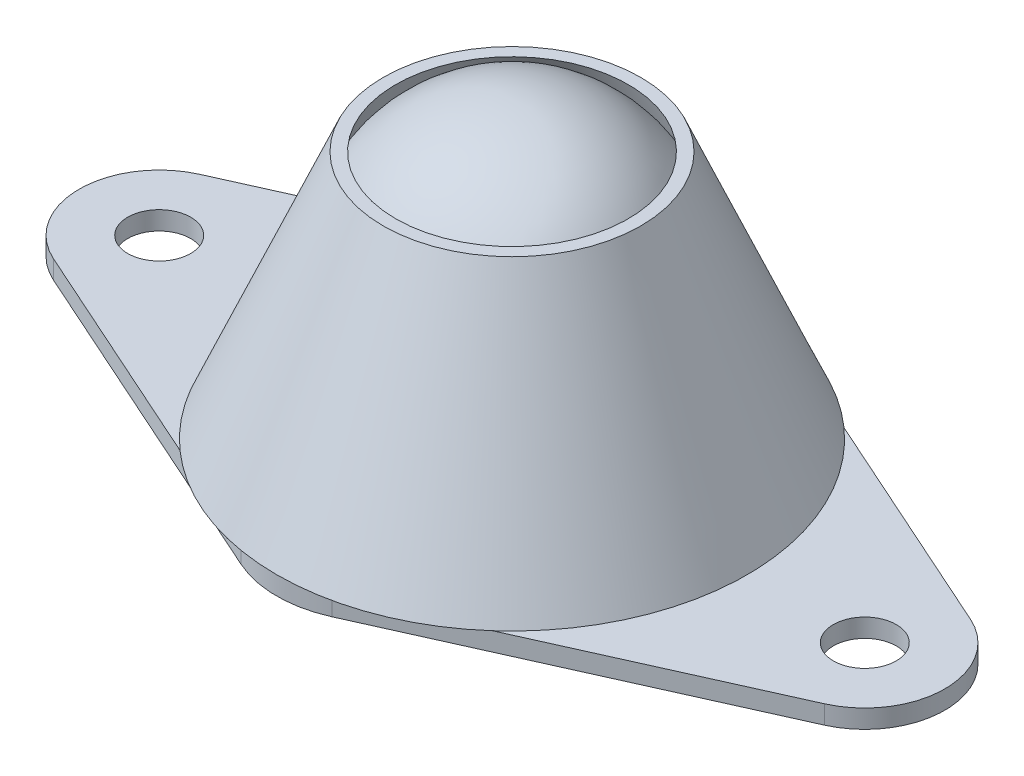
ISO-10303-21;
HEADER;
FILE_DESCRIPTION(('STEP AP214'),'2;1');
FILE_NAME('part.step','',(''),(''),'','','');
FILE_SCHEMA(('AUTOMOTIVE_DESIGN { 1 0 10303 214 1 1 1 1 }'));
ENDSEC;
DATA;
#1=APPLICATION_CONTEXT('core data for automotive mechanical design processes');
#2=APPLICATION_PROTOCOL_DEFINITION('international standard','automotive_design',2000,#1);
#3=PRODUCT_CONTEXT('',#1,'mechanical');
#4=PRODUCT('Part','Part','',(#3));
#5=PRODUCT_RELATED_PRODUCT_CATEGORY('part','',(#4));
#6=PRODUCT_DEFINITION_FORMATION('','',#4);
#7=PRODUCT_DEFINITION_CONTEXT('part definition',#1,'design');
#8=PRODUCT_DEFINITION('design','',#6,#7);
#9=PRODUCT_DEFINITION_SHAPE('','',#8);
#10=(LENGTH_UNIT() NAMED_UNIT(*) SI_UNIT(.MILLI.,.METRE.));
#11=(NAMED_UNIT(*) PLANE_ANGLE_UNIT() SI_UNIT($,.RADIAN.));
#12=(NAMED_UNIT(*) SI_UNIT($,.STERADIAN.) SOLID_ANGLE_UNIT());
#13=UNCERTAINTY_MEASURE_WITH_UNIT(LENGTH_MEASURE(1.E-05),#10,'distance_accuracy_value','');
#14=(GEOMETRIC_REPRESENTATION_CONTEXT(3) GLOBAL_UNCERTAINTY_ASSIGNED_CONTEXT((#13)) GLOBAL_UNIT_ASSIGNED_CONTEXT((#10,
#11,#12)) REPRESENTATION_CONTEXT('',''));
#15=CARTESIAN_POINT('',(0.,0.,0.));
#16=DIRECTION('',(0.,0.,1.));
#17=DIRECTION('',(1.,0.,0.));
#18=AXIS2_PLACEMENT_3D('',#15,#16,#17);
#19=CARTESIAN_POINT('',(0.,8.9375,0.));
#20=DIRECTION('',(0.,1.,0.));
#21=DIRECTION('',(1.,0.,0.));
#22=AXIS2_PLACEMENT_3D('',#19,#20,#21);
#23=SPHERICAL_SURFACE('',#22,7.9375);
#24=CARTESIAN_POINT('',(0.,16.875,0.));
#25=VERTEX_POINT('',#24);
#26=VERTEX_LOOP('',#25);
#27=FACE_BOUND('',#26,.T.);
#28=ADVANCED_FACE('F42',(#27),#23,.T.);
#29=CLOSED_SHELL('',(#28));
#30=MANIFOLD_SOLID_BREP('B2',#29);
#31=CARTESIAN_POINT('',(-19.05,1.,0.));
#32=DIRECTION('',(0.,-1.,0.));
#33=DIRECTION('',(0.,0.,-1.));
#34=AXIS2_PLACEMENT_3D('',#31,#32,#33);
#35=PLANE('',#34);
#36=CARTESIAN_POINT('',(19.05,1.,0.));
#37=DIRECTION('',(0.,-1.,0.));
#38=DIRECTION('',(0.,0.,-1.));
#39=AXIS2_PLACEMENT_3D('',#36,#37,#38);
#40=CIRCLE('',#39,1.69999999999999);
#41=CARTESIAN_POINT('',(19.05,1.,-1.7));
#42=VERTEX_POINT('',#41);
#43=EDGE_CURVE('E333',#42,#42,#40,.T.);
#44=ORIENTED_EDGE('',*,*,#43,.T.);
#45=EDGE_LOOP('',(#44));
#46=FACE_BOUND('',#45,.T.);
#47=CARTESIAN_POINT('',(0.,1.,0.));
#48=DIRECTION('',(0.,1.,0.));
#49=DIRECTION('',(0.,0.,1.));
#50=AXIS2_PLACEMENT_3D('',#47,#48,#49);
#51=CIRCLE('',#50,12.7);
#52=CARTESIAN_POINT('',(8.43601233723261,1.,9.49335008551034));
#53=VERTEX_POINT('',#52);
#54=CARTESIAN_POINT('',(8.43601233723261,1.,-9.49335008551034));
#55=VERTEX_POINT('',#54);
#56=EDGE_CURVE('E40',#53,#55,#51,.T.);
#57=ORIENTED_EDGE('',*,*,#56,.F.);
#58=DIRECTION('',(-0.912554651819627,0.,0.408954774323958));
#59=VECTOR('',#58,1.);
#60=CARTESIAN_POINT('',(20.8177314890138,1.,3.94457210124101));
#61=LINE('',#60,#59);
#62=CARTESIAN_POINT('',(20.8177314890138,1.,3.94457210124101));
#63=VERTEX_POINT('',#62);
#64=EDGE_CURVE('E206',#63,#53,#61,.T.);
#65=ORIENTED_EDGE('',*,*,#64,.F.);
#66=CARTESIAN_POINT('',(19.05,1.,0.));
#67=DIRECTION('',(0.,1.,0.));
#68=DIRECTION('',(0.,0.,1.));
#69=AXIS2_PLACEMENT_3D('',#66,#67,#68);
#70=CIRCLE('',#69,4.32255985258041);
#71=CARTESIAN_POINT('',(20.8177314890138,1.,-3.94457210124102));
#72=VERTEX_POINT('',#71);
#73=EDGE_CURVE('E203',#63,#72,#70,.T.);
#74=ORIENTED_EDGE('',*,*,#73,.T.);
#75=DIRECTION('',(-0.912554651819627,0.,-0.408954774323958));
#76=VECTOR('',#75,1.);
#77=CARTESIAN_POINT('',(20.8177314890138,1.,-3.94457210124101));
#78=LINE('',#77,#76);
#79=EDGE_CURVE('E200',#72,#55,#78,.T.);
#80=ORIENTED_EDGE('',*,*,#79,.T.);
#81=EDGE_LOOP('',(#57,#65,#74,#80));
#82=FACE_BOUND('',#81,.T.);
#83=ADVANCED_FACE('F54',(#46,#82),#35,.F.);
#84=CARTESIAN_POINT('',(-19.05,1.,0.));
#85=DIRECTION('',(0.,-1.,0.));
#86=DIRECTION('',(0.,0.,-1.));
#87=AXIS2_PLACEMENT_3D('',#84,#85,#86);
#88=CYLINDRICAL_SURFACE('',#87,4.32255985258041);
#89=CARTESIAN_POINT('',(-19.05,0.,0.));
#90=DIRECTION('',(0.,-1.,0.));
#91=DIRECTION('',(0.,0.,-1.));
#92=AXIS2_PLACEMENT_3D('',#89,#90,#91);
#93=CIRCLE('',#92,4.32255985258041);
#94=CARTESIAN_POINT('',(-20.8177314890138,0.,3.94457210124101));
#95=VERTEX_POINT('',#94);
#96=CARTESIAN_POINT('',(-20.8177314890138,0.,-3.94457210124101));
#97=VERTEX_POINT('',#96);
#98=EDGE_CURVE('E211',#95,#97,#93,.T.);
#99=ORIENTED_EDGE('',*,*,#98,.F.);
#100=DIRECTION('',(0.,-1.,0.));
#101=VECTOR('',#100,1.);
#102=CARTESIAN_POINT('',(-20.8177314890138,1.,3.94457210124101));
#103=LINE('',#102,#101);
#104=CARTESIAN_POINT('',(-20.8177314890138,1.,3.94457210124101));
#105=VERTEX_POINT('',#104);
#106=EDGE_CURVE('E174',#105,#95,#103,.T.);
#107=ORIENTED_EDGE('',*,*,#106,.F.);
#108=CARTESIAN_POINT('',(-19.05,1.,0.));
#109=DIRECTION('',(0.,-1.,0.));
#110=DIRECTION('',(0.,0.,-1.));
#111=AXIS2_PLACEMENT_3D('',#108,#109,#110);
#112=CIRCLE('',#111,4.32255985258041);
#113=CARTESIAN_POINT('',(-20.8177314890138,1.,-3.94457210124101));
#114=VERTEX_POINT('',#113);
#115=EDGE_CURVE('E147',#105,#114,#112,.T.);
#116=ORIENTED_EDGE('',*,*,#115,.T.);
#117=DIRECTION('',(0.,-1.,0.));
#118=VECTOR('',#117,1.);
#119=CARTESIAN_POINT('',(-20.8177314890138,1.,-3.94457210124101));
#120=LINE('',#119,#118);
#121=EDGE_CURVE('E58',#114,#97,#120,.T.);
#122=ORIENTED_EDGE('',*,*,#121,.T.);
#123=EDGE_LOOP('',(#99,#107,#116,#122));
#124=FACE_BOUND('',#123,.T.);
#125=ADVANCED_FACE('F56',(#124),#88,.T.);
#126=CARTESIAN_POINT('',(-20.8177314890138,1.,3.94457210124101));
#127=DIRECTION('',(0.408954774323958,0.,-0.912554651819627));
#128=DIRECTION('',(-0.912554651819627,0.,-0.408954774323958));
#129=AXIS2_PLACEMENT_3D('',#126,#127,#128);
#130=PLANE('',#129);
#131=DIRECTION('',(0.912554651819627,0.,0.408954774323958));
#132=VECTOR('',#131,1.);
#133=CARTESIAN_POINT('',(-20.8177314890138,0.,3.94457210124101));
#134=LINE('',#133,#132);
#135=CARTESIAN_POINT('',(-2.44920224739333,0.,12.1762957746575));
#136=VERTEX_POINT('',#135);
#137=EDGE_CURVE('E196',#95,#136,#134,.T.);
#138=ORIENTED_EDGE('',*,*,#137,.T.);
#139=DIRECTION('',(0.,-1.,0.));
#140=VECTOR('',#139,1.);
#141=CARTESIAN_POINT('',(-2.44920224739333,1.,12.1762957746575));
#142=LINE('',#141,#140);
#143=CARTESIAN_POINT('',(-2.44920224739333,1.,12.1762957746575));
#144=VERTEX_POINT('',#143);
#145=EDGE_CURVE('E155',#144,#136,#142,.T.);
#146=ORIENTED_EDGE('',*,*,#145,.F.);
#147=DIRECTION('',(0.912554651819627,0.,0.408954774323958));
#148=VECTOR('',#147,1.);
#149=CARTESIAN_POINT('',(-20.8177314890138,1.,3.94457210124101));
#150=LINE('',#149,#148);
#151=CARTESIAN_POINT('',(-8.43601233723261,1.,9.49335008551034));
#152=VERTEX_POINT('',#151);
#153=EDGE_CURVE('E149',#152,#144,#150,.T.);
#154=ORIENTED_EDGE('',*,*,#153,.F.);
#155=EDGE_CURVE('E143',#105,#152,#150,.T.);
#156=ORIENTED_EDGE('',*,*,#155,.F.);
#157=ORIENTED_EDGE('',*,*,#106,.T.);
#158=EDGE_LOOP('',(#138,#146,#154,#156,#157));
#159=FACE_BOUND('',#158,.T.);
#160=ADVANCED_FACE('F153',(#159),#130,.F.);
#161=CARTESIAN_POINT('',(0.,1.,6.71106821300202));
#162=DIRECTION('',(0.,-1.,0.));
#163=DIRECTION('',(0.,0.,-1.));
#164=AXIS2_PLACEMENT_3D('',#161,#162,#163);
#165=CYLINDRICAL_SURFACE('',#164,5.98893178699797);
#166=CARTESIAN_POINT('',(0.,0.,6.71106821300202));
#167=DIRECTION('',(0.,1.,0.));
#168=DIRECTION('',(0.,0.,1.));
#169=AXIS2_PLACEMENT_3D('',#166,#167,#168);
#170=CIRCLE('',#169,5.98893178699797);
#171=CARTESIAN_POINT('',(2.44920224739333,0.,12.1762957746575));
#172=VERTEX_POINT('',#171);
#173=EDGE_CURVE('E228',#136,#172,#170,.T.);
#174=ORIENTED_EDGE('',*,*,#173,.T.);
#175=DIRECTION('',(0.,-1.,0.));
#176=VECTOR('',#175,1.);
#177=CARTESIAN_POINT('',(2.44920224739333,1.,12.1762957746575));
#178=LINE('',#177,#176);
#179=CARTESIAN_POINT('',(2.44920224739333,1.,12.1762957746575));
#180=VERTEX_POINT('',#179);
#181=EDGE_CURVE('E233',#180,#172,#178,.T.);
#182=ORIENTED_EDGE('',*,*,#181,.F.);
#183=CARTESIAN_POINT('',(0.,1.,6.71106821300202));
#184=DIRECTION('',(0.,1.,0.));
#185=DIRECTION('',(0.,0.,1.));
#186=AXIS2_PLACEMENT_3D('',#183,#184,#185);
#187=CIRCLE('',#186,5.98893178699797);
#188=CARTESIAN_POINT('',(0.,0.999999999999999,12.7));
#189=VERTEX_POINT('',#188);
#190=EDGE_CURVE('E209',#189,#180,#187,.T.);
#191=ORIENTED_EDGE('',*,*,#190,.F.);
#192=EDGE_CURVE('E159',#144,#189,#187,.T.);
#193=ORIENTED_EDGE('',*,*,#192,.F.);
#194=ORIENTED_EDGE('',*,*,#145,.T.);
#195=EDGE_LOOP('',(#174,#182,#191,#193,#194));
#196=FACE_BOUND('',#195,.T.);
#197=ADVANCED_FACE('F252',(#196),#165,.T.);
#198=CARTESIAN_POINT('',(20.8177314890138,1.,3.94457210124101));
#199=DIRECTION('',(0.408954774323958,0.,0.912554651819627));
#200=DIRECTION('',(0.912554651819627,0.,-0.408954774323958));
#201=AXIS2_PLACEMENT_3D('',#198,#199,#200);
#202=PLANE('',#201);
#203=DIRECTION('',(-0.912554651819627,0.,0.408954774323958));
#204=VECTOR('',#203,1.);
#205=CARTESIAN_POINT('',(20.8177314890138,0.,3.94457210124101));
#206=LINE('',#205,#204);
#207=CARTESIAN_POINT('',(20.8177314890138,0.,3.94457210124101));
#208=VERTEX_POINT('',#207);
#209=EDGE_CURVE('E225',#208,#172,#206,.T.);
#210=ORIENTED_EDGE('',*,*,#209,.F.);
#211=DIRECTION('',(0.,-1.,0.));
#212=VECTOR('',#211,1.);
#213=CARTESIAN_POINT('',(20.8177314890138,1.,3.94457210124101));
#214=LINE('',#213,#212);
#215=EDGE_CURVE('E235',#63,#208,#214,.T.);
#216=ORIENTED_EDGE('',*,*,#215,.F.);
#217=ORIENTED_EDGE('',*,*,#64,.T.);
#218=EDGE_CURVE('E205',#53,#180,#61,.T.);
#219=ORIENTED_EDGE('',*,*,#218,.T.);
#220=ORIENTED_EDGE('',*,*,#181,.T.);
#221=EDGE_LOOP('',(#210,#216,#217,#219,#220));
#222=FACE_BOUND('',#221,.T.);
#223=ADVANCED_FACE('F260',(#222),#202,.T.);
#224=CARTESIAN_POINT('',(19.05,1.,0.));
#225=DIRECTION('',(0.,-1.,0.));
#226=DIRECTION('',(0.,0.,-1.));
#227=AXIS2_PLACEMENT_3D('',#224,#225,#226);
#228=CYLINDRICAL_SURFACE('',#227,4.32255985258041);
#229=CARTESIAN_POINT('',(19.05,0.,0.));
#230=DIRECTION('',(0.,1.,0.));
#231=DIRECTION('',(0.,0.,1.));
#232=AXIS2_PLACEMENT_3D('',#229,#230,#231);
#233=CIRCLE('',#232,4.32255985258041);
#234=CARTESIAN_POINT('',(20.8177314890138,0.,-3.94457210124102));
#235=VERTEX_POINT('',#234);
#236=EDGE_CURVE('E223',#208,#235,#233,.T.);
#237=ORIENTED_EDGE('',*,*,#236,.T.);
#238=DIRECTION('',(0.,-1.,0.));
#239=VECTOR('',#238,1.);
#240=CARTESIAN_POINT('',(20.8177314890138,1.,-3.94457210124102));
#241=LINE('',#240,#239);
#242=EDGE_CURVE('E237',#72,#235,#241,.T.);
#243=ORIENTED_EDGE('',*,*,#242,.F.);
#244=ORIENTED_EDGE('',*,*,#73,.F.);
#245=ORIENTED_EDGE('',*,*,#215,.T.);
#246=EDGE_LOOP('',(#237,#243,#244,#245));
#247=FACE_BOUND('',#246,.T.);
#248=ADVANCED_FACE('F272',(#247),#228,.T.);
#249=CARTESIAN_POINT('',(20.8177314890138,1.,-3.94457210124101));
#250=DIRECTION('',(-0.408954774323958,0.,0.912554651819627));
#251=DIRECTION('',(0.912554651819627,0.,0.408954774323958));
#252=AXIS2_PLACEMENT_3D('',#249,#250,#251);
#253=PLANE('',#252);
#254=DIRECTION('',(-0.912554651819627,0.,-0.408954774323958));
#255=VECTOR('',#254,1.);
#256=CARTESIAN_POINT('',(20.8177314890138,0.,-3.94457210124101));
#257=LINE('',#256,#255);
#258=CARTESIAN_POINT('',(2.44920224739333,0.,-12.1762957746575));
#259=VERTEX_POINT('',#258);
#260=EDGE_CURVE('E220',#235,#259,#257,.T.);
#261=ORIENTED_EDGE('',*,*,#260,.T.);
#262=DIRECTION('',(0.,-1.,0.));
#263=VECTOR('',#262,1.);
#264=CARTESIAN_POINT('',(2.44920224739333,1.,-12.1762957746575));
#265=LINE('',#264,#263);
#266=CARTESIAN_POINT('',(2.44920224739333,1.,-12.1762957746575));
#267=VERTEX_POINT('',#266);
#268=EDGE_CURVE('E240',#267,#259,#265,.T.);
#269=ORIENTED_EDGE('',*,*,#268,.F.);
#270=EDGE_CURVE('E185',#55,#267,#78,.T.);
#271=ORIENTED_EDGE('',*,*,#270,.F.);
#272=ORIENTED_EDGE('',*,*,#79,.F.);
#273=ORIENTED_EDGE('',*,*,#242,.T.);
#274=EDGE_LOOP('',(#261,#269,#271,#272,#273));
#275=FACE_BOUND('',#274,.T.);
#276=ADVANCED_FACE('F267',(#275),#253,.F.);
#277=CARTESIAN_POINT('',(0.,1.,-6.71106821300202));
#278=DIRECTION('',(0.,-1.,0.));
#279=DIRECTION('',(0.,0.,-1.));
#280=AXIS2_PLACEMENT_3D('',#277,#278,#279);
#281=CYLINDRICAL_SURFACE('',#280,5.98893178699797);
#282=CARTESIAN_POINT('',(0.,0.,-6.71106821300202));
#283=DIRECTION('',(0.,-1.,0.));
#284=DIRECTION('',(0.,0.,-1.));
#285=AXIS2_PLACEMENT_3D('',#282,#283,#284);
#286=CIRCLE('',#285,5.98893178699797);
#287=CARTESIAN_POINT('',(-2.44920224739333,0.,-12.1762957746575));
#288=VERTEX_POINT('',#287);
#289=EDGE_CURVE('E217',#288,#259,#286,.T.);
#290=ORIENTED_EDGE('',*,*,#289,.F.);
#291=DIRECTION('',(0.,-1.,0.));
#292=VECTOR('',#291,1.);
#293=CARTESIAN_POINT('',(-2.44920224739333,1.,-12.1762957746575));
#294=LINE('',#293,#292);
#295=CARTESIAN_POINT('',(-2.44920224739333,1.,-12.1762957746575));
#296=VERTEX_POINT('',#295);
#297=EDGE_CURVE('E241',#296,#288,#294,.T.);
#298=ORIENTED_EDGE('',*,*,#297,.F.);
#299=CARTESIAN_POINT('',(0.,1.,-6.71106821300202));
#300=DIRECTION('',(0.,-1.,0.));
#301=DIRECTION('',(0.,0.,-1.));
#302=AXIS2_PLACEMENT_3D('',#299,#300,#301);
#303=CIRCLE('',#302,5.98893178699797);
#304=CARTESIAN_POINT('',(0.,0.999999999999999,-12.7));
#305=VERTEX_POINT('',#304);
#306=EDGE_CURVE('E79',#296,#305,#303,.T.);
#307=ORIENTED_EDGE('',*,*,#306,.T.);
#308=EDGE_CURVE('E186',#305,#267,#303,.T.);
#309=ORIENTED_EDGE('',*,*,#308,.T.);
#310=ORIENTED_EDGE('',*,*,#268,.T.);
#311=EDGE_LOOP('',(#290,#298,#307,#309,#310));
#312=FACE_BOUND('',#311,.T.);
#313=ADVANCED_FACE('F269',(#312),#281,.T.);
#314=CARTESIAN_POINT('',(-20.8177314890138,1.,-3.94457210124101));
#315=DIRECTION('',(-0.408954774323958,0.,-0.912554651819627));
#316=DIRECTION('',(-0.912554651819627,0.,0.408954774323958));
#317=AXIS2_PLACEMENT_3D('',#314,#315,#316);
#318=PLANE('',#317);
#319=DIRECTION('',(0.912554651819627,0.,-0.408954774323958));
#320=VECTOR('',#319,1.);
#321=CARTESIAN_POINT('',(-20.8177314890138,0.,-3.94457210124101));
#322=LINE('',#321,#320);
#323=EDGE_CURVE('E214',#97,#288,#322,.T.);
#324=ORIENTED_EDGE('',*,*,#323,.F.);
#325=ORIENTED_EDGE('',*,*,#121,.F.);
#326=DIRECTION('',(0.912554651819627,0.,-0.408954774323958));
#327=VECTOR('',#326,1.);
#328=CARTESIAN_POINT('',(-20.8177314890138,1.,-3.94457210124101));
#329=LINE('',#328,#327);
#330=CARTESIAN_POINT('',(-8.43601233723261,1.,-9.49335008551034));
#331=VERTEX_POINT('',#330);
#332=EDGE_CURVE('E188',#114,#331,#329,.T.);
#333=ORIENTED_EDGE('',*,*,#332,.T.);
#334=EDGE_CURVE('E193',#331,#296,#329,.T.);
#335=ORIENTED_EDGE('',*,*,#334,.T.);
#336=ORIENTED_EDGE('',*,*,#297,.T.);
#337=EDGE_LOOP('',(#324,#325,#333,#335,#336));
#338=FACE_BOUND('',#337,.T.);
#339=ADVANCED_FACE('F246',(#338),#318,.T.);
#340=CARTESIAN_POINT('',(-19.05,1.,0.));
#341=DIRECTION('',(0.,-1.,0.));
#342=DIRECTION('',(0.,0.,-1.));
#343=AXIS2_PLACEMENT_3D('',#340,#341,#342);
#344=CIRCLE('',#343,1.69999999999999);
#345=CARTESIAN_POINT('',(-19.05,1.,-1.69999999999999));
#346=VERTEX_POINT('',#345);
#347=EDGE_CURVE('E337',#346,#346,#344,.T.);
#348=ORIENTED_EDGE('',*,*,#347,.T.);
#349=EDGE_LOOP('',(#348));
#350=FACE_BOUND('',#349,.T.);
#351=EDGE_CURVE('E63',#331,#152,#51,.T.);
#352=ORIENTED_EDGE('',*,*,#351,.F.);
#353=ORIENTED_EDGE('',*,*,#332,.F.);
#354=ORIENTED_EDGE('',*,*,#115,.F.);
#355=ORIENTED_EDGE('',*,*,#155,.T.);
#356=EDGE_LOOP('',(#352,#353,#354,#355));
#357=FACE_BOUND('',#356,.T.);
#358=ADVANCED_FACE('F145',(#350,#357),#35,.F.);
#359=CARTESIAN_POINT('',(-19.05,0.,0.));
#360=DIRECTION('',(0.,-1.,0.));
#361=DIRECTION('',(0.,0.,-1.));
#362=AXIS2_PLACEMENT_3D('',#359,#360,#361);
#363=PLANE('',#362);
#364=CARTESIAN_POINT('',(19.05,0.,0.));
#365=DIRECTION('',(0.,-1.,0.));
#366=DIRECTION('',(0.,0.,-1.));
#367=AXIS2_PLACEMENT_3D('',#364,#365,#366);
#368=CIRCLE('',#367,1.69999999999999);
#369=CARTESIAN_POINT('',(19.05,0.,-1.7));
#370=VERTEX_POINT('',#369);
#371=EDGE_CURVE('E331',#370,#370,#368,.T.);
#372=ORIENTED_EDGE('',*,*,#371,.F.);
#373=EDGE_LOOP('',(#372));
#374=FACE_BOUND('',#373,.T.);
#375=CARTESIAN_POINT('',(-19.05,0.,0.));
#376=DIRECTION('',(0.,-1.,0.));
#377=DIRECTION('',(0.,0.,-1.));
#378=AXIS2_PLACEMENT_3D('',#375,#376,#377);
#379=CIRCLE('',#378,1.69999999999999);
#380=CARTESIAN_POINT('',(-19.05,0.,-1.69999999999999));
#381=VERTEX_POINT('',#380);
#382=EDGE_CURVE('E334',#381,#381,#379,.T.);
#383=ORIENTED_EDGE('',*,*,#382,.F.);
#384=EDGE_LOOP('',(#383));
#385=FACE_BOUND('',#384,.T.);
#386=ORIENTED_EDGE('',*,*,#98,.T.);
#387=ORIENTED_EDGE('',*,*,#323,.T.);
#388=ORIENTED_EDGE('',*,*,#289,.T.);
#389=ORIENTED_EDGE('',*,*,#260,.F.);
#390=ORIENTED_EDGE('',*,*,#236,.F.);
#391=ORIENTED_EDGE('',*,*,#209,.T.);
#392=ORIENTED_EDGE('',*,*,#173,.F.);
#393=ORIENTED_EDGE('',*,*,#137,.F.);
#394=EDGE_LOOP('',(#386,#387,#388,#389,#390,#391,#392,#393));
#395=FACE_BOUND('',#394,.T.);
#396=ADVANCED_FACE('F249',(#374,#385,#395),#363,.T.);
#397=CARTESIAN_POINT('',(0.,1.,0.));
#398=DIRECTION('',(0.,-1.,0.));
#399=DIRECTION('',(0.,0.,-1.));
#400=AXIS2_PLACEMENT_3D('',#397,#398,#399);
#401=PLANE('',#400);
#402=EDGE_CURVE('E161',#152,#189,#51,.T.);
#403=ORIENTED_EDGE('',*,*,#402,.F.);
#404=ORIENTED_EDGE('',*,*,#153,.T.);
#405=ORIENTED_EDGE('',*,*,#192,.T.);
#406=EDGE_LOOP('',(#403,#404,#405));
#407=FACE_BOUND('',#406,.T.);
#408=ADVANCED_FACE('F162',(#407),#401,.T.);
#409=EDGE_CURVE('E168',#189,#53,#51,.T.);
#410=ORIENTED_EDGE('',*,*,#409,.F.);
#411=ORIENTED_EDGE('',*,*,#190,.T.);
#412=ORIENTED_EDGE('',*,*,#218,.F.);
#413=EDGE_LOOP('',(#410,#411,#412));
#414=FACE_BOUND('',#413,.T.);
#415=ADVANCED_FACE('F257',(#414),#401,.T.);
#416=ORIENTED_EDGE('',*,*,#306,.F.);
#417=ORIENTED_EDGE('',*,*,#334,.F.);
#418=EDGE_CURVE('E166',#305,#331,#51,.T.);
#419=ORIENTED_EDGE('',*,*,#418,.F.);
#420=EDGE_LOOP('',(#416,#417,#419));
#421=FACE_BOUND('',#420,.T.);
#422=ADVANCED_FACE('F192',(#421),#401,.T.);
#423=CARTESIAN_POINT('',(0.,7.47503467374569,0.));
#424=DIRECTION('',(0.,-1.,0.));
#425=DIRECTION('',(0.,0.,-1.));
#426=AXIS2_PLACEMENT_3D('',#423,#424,#425);
#427=CONICAL_SURFACE('',#426,9.25879899132678,0.404207394823542);
#428=CARTESIAN_POINT('',(0.,7.47503467374569,0.));
#429=DIRECTION('',(0.,1.,0.));
#430=DIRECTION('',(0.,0.,1.));
#431=AXIS2_PLACEMENT_3D('',#428,#429,#430);
#432=CIRCLE('',#431,9.25879899132678);
#433=CARTESIAN_POINT('',(0.,7.47503467374569,9.25879899132678));
#434=VERTEX_POINT('',#433);
#435=EDGE_CURVE('E180',#434,#434,#432,.T.);
#436=ORIENTED_EDGE('',*,*,#435,.F.);
#437=EDGE_LOOP('',(#436));
#438=FACE_BOUND('',#437,.T.);
#439=CARTESIAN_POINT('',(0.,14.438436679086,0.));
#440=DIRECTION('',(0.,1.,0.));
#441=DIRECTION('',(0.,0.,1.));
#442=AXIS2_PLACEMENT_3D('',#439,#440,#441);
#443=CIRCLE('',#442,6.28012321719424);
#444=CARTESIAN_POINT('',(0.,14.438436679086,6.28012321719424));
#445=VERTEX_POINT('',#444);
#446=EDGE_CURVE('E343',#445,#445,#443,.T.);
#447=ORIENTED_EDGE('',*,*,#446,.T.);
#448=EDGE_LOOP('',(#447));
#449=FACE_BOUND('',#448,.T.);
#450=ADVANCED_FACE('F311',(#438,#449),#427,.F.);
#451=CARTESIAN_POINT('',(0.,1.,0.));
#452=DIRECTION('',(0.,1.,0.));
#453=DIRECTION('',(0.,0.,1.));
#454=AXIS2_PLACEMENT_3D('',#451,#452,#453);
#455=CONICAL_SURFACE('',#454,3.60802322023482,0.717526999699673);
#456=ORIENTED_EDGE('',*,*,#435,.T.);
#457=EDGE_LOOP('',(#456));
#458=FACE_BOUND('',#457,.T.);
#459=CARTESIAN_POINT('',(0.,1.,0.));
#460=DIRECTION('',(0.,1.,0.));
#461=DIRECTION('',(0.,0.,1.));
#462=AXIS2_PLACEMENT_3D('',#459,#460,#461);
#463=CIRCLE('',#462,3.60802322023482);
#464=CARTESIAN_POINT('',(0.,1.,3.60802322023482));
#465=VERTEX_POINT('',#464);
#466=EDGE_CURVE('E178',#465,#465,#463,.T.);
#467=ORIENTED_EDGE('',*,*,#466,.F.);
#468=EDGE_LOOP('',(#467));
#469=FACE_BOUND('',#468,.T.);
#470=ADVANCED_FACE('F309',(#458,#469),#455,.F.);
#471=EDGE_CURVE('E65',#55,#305,#51,.T.);
#472=ORIENTED_EDGE('',*,*,#471,.F.);
#473=ORIENTED_EDGE('',*,*,#270,.T.);
#474=ORIENTED_EDGE('',*,*,#308,.F.);
#475=EDGE_LOOP('',(#472,#473,#474));
#476=FACE_BOUND('',#475,.T.);
#477=ADVANCED_FACE('F184',(#476),#401,.T.);
#478=CARTESIAN_POINT('',(0.,14.438436679086,0.));
#479=DIRECTION('',(0.,-1.,0.));
#480=DIRECTION('',(0.,0.,-1.));
#481=AXIS2_PLACEMENT_3D('',#478,#479,#480);
#482=CONICAL_SURFACE('',#481,6.9515532282196,0.404207394823542);
#483=ORIENTED_EDGE('',*,*,#409,.T.);
#484=ORIENTED_EDGE('',*,*,#56,.T.);
#485=ORIENTED_EDGE('',*,*,#471,.T.);
#486=ORIENTED_EDGE('',*,*,#418,.T.);
#487=ORIENTED_EDGE('',*,*,#351,.T.);
#488=ORIENTED_EDGE('',*,*,#402,.T.);
#489=EDGE_LOOP('',(#483,#484,#485,#486,#487,#488));
#490=FACE_BOUND('',#489,.T.);
#491=CARTESIAN_POINT('',(0.,14.438436679086,0.));
#492=DIRECTION('',(0.,1.,0.));
#493=DIRECTION('',(0.,0.,1.));
#494=AXIS2_PLACEMENT_3D('',#491,#492,#493);
#495=CIRCLE('',#494,6.9515532282196);
#496=CARTESIAN_POINT('',(0.,14.438436679086,6.9515532282196));
#497=VERTEX_POINT('',#496);
#498=EDGE_CURVE('E167',#497,#497,#495,.T.);
#499=ORIENTED_EDGE('',*,*,#498,.F.);
#500=EDGE_LOOP('',(#499));
#501=FACE_BOUND('',#500,.T.);
#502=ADVANCED_FACE('F170',(#490,#501),#482,.T.);
#503=CARTESIAN_POINT('',(0.,14.438436679086,0.));
#504=DIRECTION('',(0.,1.,0.));
#505=DIRECTION('',(0.,0.,1.));
#506=AXIS2_PLACEMENT_3D('',#503,#504,#505);
#507=PLANE('',#506);
#508=ORIENTED_EDGE('',*,*,#498,.T.);
#509=EDGE_LOOP('',(#508));
#510=FACE_BOUND('',#509,.T.);
#511=ORIENTED_EDGE('',*,*,#446,.F.);
#512=EDGE_LOOP('',(#511));
#513=FACE_BOUND('',#512,.T.);
#514=ADVANCED_FACE('F295',(#510,#513),#507,.T.);
#515=CARTESIAN_POINT('',(0.,1.,0.));
#516=VERTEX_POINT('',#515);
#517=VERTEX_LOOP('',#516);
#518=FACE_BOUND('',#517,.T.);
#519=ORIENTED_EDGE('',*,*,#466,.T.);
#520=EDGE_LOOP('',(#519));
#521=FACE_BOUND('',#520,.T.);
#522=ADVANCED_FACE('F284',(#518,#521),#35,.F.);
#523=CARTESIAN_POINT('',(-19.05,0.,0.));
#524=DIRECTION('',(0.,-1.,0.));
#525=DIRECTION('',(0.,0.,-1.));
#526=AXIS2_PLACEMENT_3D('',#523,#524,#525);
#527=CYLINDRICAL_SURFACE('',#526,1.69999999999999);
#528=ORIENTED_EDGE('',*,*,#382,.T.);
#529=EDGE_LOOP('',(#528));
#530=FACE_BOUND('',#529,.T.);
#531=ORIENTED_EDGE('',*,*,#347,.F.);
#532=EDGE_LOOP('',(#531));
#533=FACE_BOUND('',#532,.T.);
#534=ADVANCED_FACE('F294',(#530,#533),#527,.F.);
#535=CARTESIAN_POINT('',(19.05,0.,0.));
#536=DIRECTION('',(0.,-1.,0.));
#537=DIRECTION('',(0.,0.,-1.));
#538=AXIS2_PLACEMENT_3D('',#535,#536,#537);
#539=CYLINDRICAL_SURFACE('',#538,1.69999999999999);
#540=ORIENTED_EDGE('',*,*,#371,.T.);
#541=EDGE_LOOP('',(#540));
#542=FACE_BOUND('',#541,.T.);
#543=ORIENTED_EDGE('',*,*,#43,.F.);
#544=EDGE_LOOP('',(#543));
#545=FACE_BOUND('',#544,.T.);
#546=ADVANCED_FACE('F301',(#542,#545),#539,.F.);
#547=CLOSED_SHELL('',(#83,#125,#160,#197,#223,#248,#276,#313,#339,#358,#396,#408,#415,#422,#450,
#470,#477,#502,#514,#522,#534,#546));
#548=MANIFOLD_SOLID_BREP('B6',#547);
#549=ADVANCED_BREP_SHAPE_REPRESENTATION('',(#18,#30,#548),#14);
#550=SHAPE_DEFINITION_REPRESENTATION(#9,#549);
ENDSEC;
END-ISO-10303-21;
